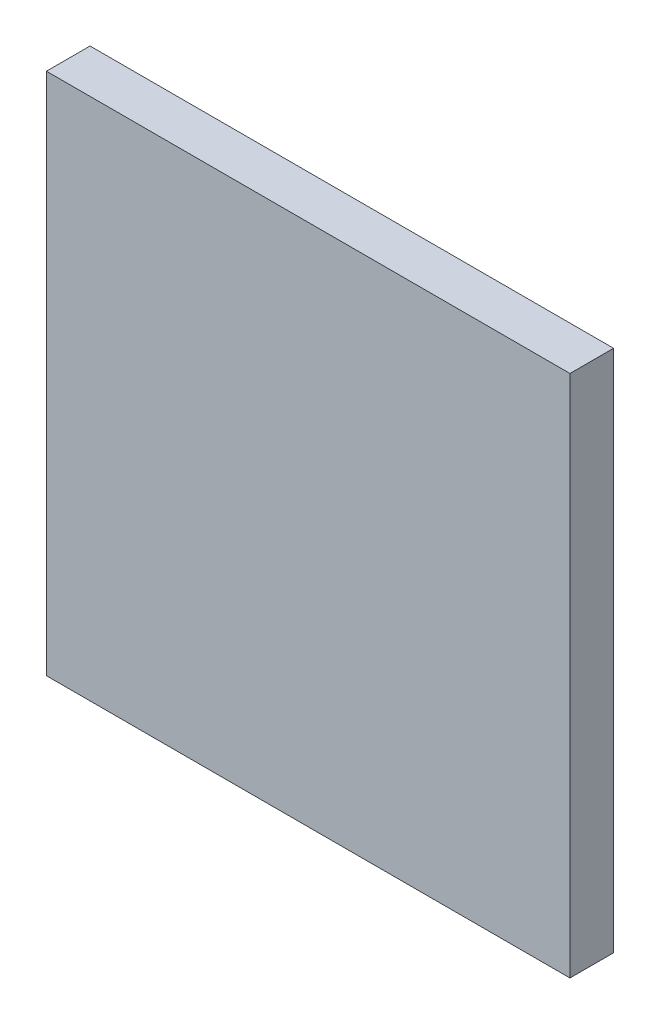
ISO-10303-21;
HEADER;
FILE_DESCRIPTION(('STEP AP214'),'2;1');
FILE_NAME('part.step','',(''),(''),'','','');
FILE_SCHEMA(('AUTOMOTIVE_DESIGN { 1 0 10303 214 1 1 1 1 }'));
ENDSEC;
DATA;
#1=APPLICATION_CONTEXT('core data for automotive mechanical design processes');
#2=APPLICATION_PROTOCOL_DEFINITION('international standard','automotive_design',2000,#1);
#3=PRODUCT_CONTEXT('',#1,'mechanical');
#4=PRODUCT('Part','Part','',(#3));
#5=PRODUCT_RELATED_PRODUCT_CATEGORY('part','',(#4));
#6=PRODUCT_DEFINITION_FORMATION('','',#4);
#7=PRODUCT_DEFINITION_CONTEXT('part definition',#1,'design');
#8=PRODUCT_DEFINITION('design','',#6,#7);
#9=PRODUCT_DEFINITION_SHAPE('','',#8);
#10=(LENGTH_UNIT() NAMED_UNIT(*) SI_UNIT(.MILLI.,.METRE.));
#11=(NAMED_UNIT(*) PLANE_ANGLE_UNIT() SI_UNIT($,.RADIAN.));
#12=(NAMED_UNIT(*) SI_UNIT($,.STERADIAN.) SOLID_ANGLE_UNIT());
#13=UNCERTAINTY_MEASURE_WITH_UNIT(LENGTH_MEASURE(1.E-05),#10,'distance_accuracy_value','');
#14=(GEOMETRIC_REPRESENTATION_CONTEXT(3) GLOBAL_UNCERTAINTY_ASSIGNED_CONTEXT((#13)) GLOBAL_UNIT_ASSIGNED_CONTEXT((#10,
#11,#12)) REPRESENTATION_CONTEXT('',''));
#15=CARTESIAN_POINT('',(0.,0.,0.));
#16=DIRECTION('',(0.,0.,1.));
#17=DIRECTION('',(1.,0.,0.));
#18=AXIS2_PLACEMENT_3D('',#15,#16,#17);
#19=CARTESIAN_POINT('',(-76.2,76.2,12.7));
#20=DIRECTION('',(1.,0.,0.));
#21=DIRECTION('',(0.,0.,-1.));
#22=AXIS2_PLACEMENT_3D('',#19,#20,#21);
#23=PLANE('',#22);
#24=DIRECTION('',(0.,-1.,0.));
#25=VECTOR('',#24,1.);
#26=CARTESIAN_POINT('',(-76.2,76.2,0.));
#27=LINE('',#26,#25);
#28=CARTESIAN_POINT('',(-76.2,76.2,0.));
#29=VERTEX_POINT('',#28);
#30=CARTESIAN_POINT('',(-76.2,-76.2,0.));
#31=VERTEX_POINT('',#30);
#32=EDGE_CURVE('E107',#29,#31,#27,.T.);
#33=ORIENTED_EDGE('',*,*,#32,.T.);
#34=DIRECTION('',(0.,0.,-1.));
#35=VECTOR('',#34,1.);
#36=CARTESIAN_POINT('',(-76.2,-76.2,12.7));
#37=LINE('',#36,#35);
#38=CARTESIAN_POINT('',(-76.2,-76.2,12.7));
#39=VERTEX_POINT('',#38);
#40=EDGE_CURVE('E11',#39,#31,#37,.T.);
#41=ORIENTED_EDGE('',*,*,#40,.F.);
#42=DIRECTION('',(0.,-1.,0.));
#43=VECTOR('',#42,1.);
#44=CARTESIAN_POINT('',(-76.2,76.2,12.7));
#45=LINE('',#44,#43);
#46=CARTESIAN_POINT('',(-76.2,76.2,12.7));
#47=VERTEX_POINT('',#46);
#48=EDGE_CURVE('E91',#47,#39,#45,.T.);
#49=ORIENTED_EDGE('',*,*,#48,.F.);
#50=DIRECTION('',(0.,0.,-1.));
#51=VECTOR('',#50,1.);
#52=CARTESIAN_POINT('',(-76.2,76.2,12.7));
#53=LINE('',#52,#51);
#54=EDGE_CURVE('E103',#47,#29,#53,.T.);
#55=ORIENTED_EDGE('',*,*,#54,.T.);
#56=EDGE_LOOP('',(#33,#41,#49,#55));
#57=FACE_BOUND('',#56,.T.);
#58=ADVANCED_FACE('F39',(#57),#23,.F.);
#59=CARTESIAN_POINT('',(76.2,-76.2,12.7));
#60=DIRECTION('',(0.,1.,0.));
#61=DIRECTION('',(-1.,0.,0.));
#62=AXIS2_PLACEMENT_3D('',#59,#60,#61);
#63=PLANE('',#62);
#64=DIRECTION('',(1.,0.,0.));
#65=VECTOR('',#64,1.);
#66=CARTESIAN_POINT('',(76.2,-76.2,0.));
#67=LINE('',#66,#65);
#68=CARTESIAN_POINT('',(76.2,-76.2,0.));
#69=VERTEX_POINT('',#68);
#70=EDGE_CURVE('E96',#31,#69,#67,.T.);
#71=ORIENTED_EDGE('',*,*,#70,.T.);
#72=DIRECTION('',(0.,0.,-1.));
#73=VECTOR('',#72,1.);
#74=CARTESIAN_POINT('',(76.2,-76.2,12.7));
#75=LINE('',#74,#73);
#76=CARTESIAN_POINT('',(76.2,-76.2,12.7));
#77=VERTEX_POINT('',#76);
#78=EDGE_CURVE('E48',#77,#69,#75,.T.);
#79=ORIENTED_EDGE('',*,*,#78,.F.);
#80=DIRECTION('',(1.,0.,0.));
#81=VECTOR('',#80,1.);
#82=CARTESIAN_POINT('',(76.2,-76.2,12.7));
#83=LINE('',#82,#81);
#84=EDGE_CURVE('E86',#39,#77,#83,.T.);
#85=ORIENTED_EDGE('',*,*,#84,.F.);
#86=ORIENTED_EDGE('',*,*,#40,.T.);
#87=EDGE_LOOP('',(#71,#79,#85,#86));
#88=FACE_BOUND('',#87,.T.);
#89=ADVANCED_FACE('F95',(#88),#63,.F.);
#90=CARTESIAN_POINT('',(76.2,76.2,12.7));
#91=DIRECTION('',(-1.,0.,0.));
#92=DIRECTION('',(0.,-1.,0.));
#93=AXIS2_PLACEMENT_3D('',#90,#91,#92);
#94=PLANE('',#93);
#95=DIRECTION('',(0.,1.,0.));
#96=VECTOR('',#95,1.);
#97=CARTESIAN_POINT('',(76.2,76.2,0.));
#98=LINE('',#97,#96);
#99=CARTESIAN_POINT('',(76.2,76.2,0.));
#100=VERTEX_POINT('',#99);
#101=EDGE_CURVE('E73',#69,#100,#98,.T.);
#102=ORIENTED_EDGE('',*,*,#101,.T.);
#103=DIRECTION('',(0.,0.,-1.));
#104=VECTOR('',#103,1.);
#105=CARTESIAN_POINT('',(76.2,76.2,12.7));
#106=LINE('',#105,#104);
#107=CARTESIAN_POINT('',(76.2,76.2,12.7));
#108=VERTEX_POINT('',#107);
#109=EDGE_CURVE('E98',#108,#100,#106,.T.);
#110=ORIENTED_EDGE('',*,*,#109,.F.);
#111=DIRECTION('',(0.,1.,0.));
#112=VECTOR('',#111,1.);
#113=CARTESIAN_POINT('',(76.2,76.2,12.7));
#114=LINE('',#113,#112);
#115=EDGE_CURVE('E89',#77,#108,#114,.T.);
#116=ORIENTED_EDGE('',*,*,#115,.F.);
#117=ORIENTED_EDGE('',*,*,#78,.T.);
#118=EDGE_LOOP('',(#102,#110,#116,#117));
#119=FACE_BOUND('',#118,.T.);
#120=ADVANCED_FACE('F99',(#119),#94,.F.);
#121=CARTESIAN_POINT('',(76.2,76.2,12.7));
#122=DIRECTION('',(0.,-1.,0.));
#123=DIRECTION('',(1.,0.,0.));
#124=AXIS2_PLACEMENT_3D('',#121,#122,#123);
#125=PLANE('',#124);
#126=DIRECTION('',(-1.,0.,0.));
#127=VECTOR('',#126,1.);
#128=CARTESIAN_POINT('',(76.2,76.2,0.));
#129=LINE('',#128,#127);
#130=EDGE_CURVE('E79',#100,#29,#129,.T.);
#131=ORIENTED_EDGE('',*,*,#130,.T.);
#132=ORIENTED_EDGE('',*,*,#54,.F.);
#133=DIRECTION('',(-1.,0.,0.));
#134=VECTOR('',#133,1.);
#135=CARTESIAN_POINT('',(76.2,76.2,12.7));
#136=LINE('',#135,#134);
#137=EDGE_CURVE('E56',#108,#47,#136,.T.);
#138=ORIENTED_EDGE('',*,*,#137,.F.);
#139=ORIENTED_EDGE('',*,*,#109,.T.);
#140=EDGE_LOOP('',(#131,#132,#138,#139));
#141=FACE_BOUND('',#140,.T.);
#142=ADVANCED_FACE('F120',(#141),#125,.F.);
#143=CARTESIAN_POINT('',(0.,0.,12.7));
#144=DIRECTION('',(0.,0.,-1.));
#145=DIRECTION('',(-1.,0.,0.));
#146=AXIS2_PLACEMENT_3D('',#143,#144,#145);
#147=PLANE('',#146);
#148=ORIENTED_EDGE('',*,*,#48,.T.);
#149=ORIENTED_EDGE('',*,*,#84,.T.);
#150=ORIENTED_EDGE('',*,*,#115,.T.);
#151=ORIENTED_EDGE('',*,*,#137,.T.);
#152=EDGE_LOOP('',(#148,#149,#150,#151));
#153=FACE_BOUND('',#152,.T.);
#154=ADVANCED_FACE('F87',(#153),#147,.F.);
#155=CARTESIAN_POINT('',(0.,0.,0.));
#156=DIRECTION('',(0.,0.,-1.));
#157=DIRECTION('',(-1.,0.,0.));
#158=AXIS2_PLACEMENT_3D('',#155,#156,#157);
#159=PLANE('',#158);
#160=ORIENTED_EDGE('',*,*,#32,.F.);
#161=ORIENTED_EDGE('',*,*,#130,.F.);
#162=ORIENTED_EDGE('',*,*,#101,.F.);
#163=ORIENTED_EDGE('',*,*,#70,.F.);
#164=EDGE_LOOP('',(#160,#161,#162,#163));
#165=FACE_BOUND('',#164,.T.);
#166=ADVANCED_FACE('F123',(#165),#159,.T.);
#167=CLOSED_SHELL('',(#58,#89,#120,#142,#154,#166));
#168=MANIFOLD_SOLID_BREP('B2',#167);
#169=ADVANCED_BREP_SHAPE_REPRESENTATION('',(#18,#168),#14);
#170=SHAPE_DEFINITION_REPRESENTATION(#9,#169);
ENDSEC;
END-ISO-10303-21;
